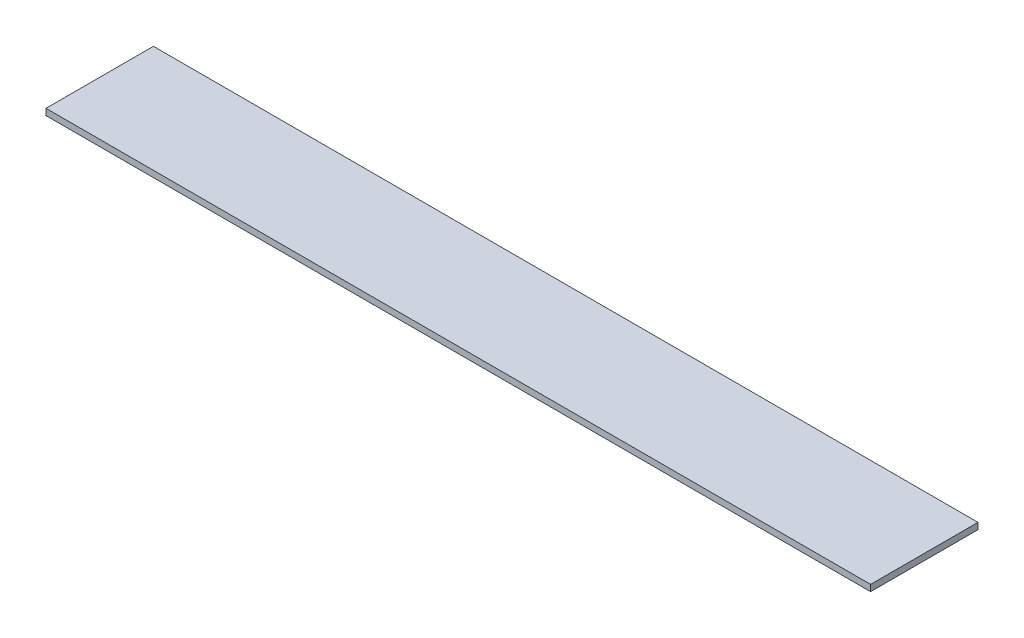
ISO-10303-21;
HEADER;
FILE_DESCRIPTION(('STEP AP214'),'2;1');
FILE_NAME('part.step','',(''),(''),'','','');
FILE_SCHEMA(('AUTOMOTIVE_DESIGN { 1 0 10303 214 1 1 1 1 }'));
ENDSEC;
DATA;
#1=APPLICATION_CONTEXT('core data for automotive mechanical design processes');
#2=APPLICATION_PROTOCOL_DEFINITION('international standard','automotive_design',2000,#1);
#3=PRODUCT_CONTEXT('',#1,'mechanical');
#4=PRODUCT('Part','Part','',(#3));
#5=PRODUCT_RELATED_PRODUCT_CATEGORY('part','',(#4));
#6=PRODUCT_DEFINITION_FORMATION('','',#4);
#7=PRODUCT_DEFINITION_CONTEXT('part definition',#1,'design');
#8=PRODUCT_DEFINITION('design','',#6,#7);
#9=PRODUCT_DEFINITION_SHAPE('','',#8);
#10=(LENGTH_UNIT() NAMED_UNIT(*) SI_UNIT(.MILLI.,.METRE.));
#11=(NAMED_UNIT(*) PLANE_ANGLE_UNIT() SI_UNIT($,.RADIAN.));
#12=(NAMED_UNIT(*) SI_UNIT($,.STERADIAN.) SOLID_ANGLE_UNIT());
#13=UNCERTAINTY_MEASURE_WITH_UNIT(LENGTH_MEASURE(1.E-05),#10,'distance_accuracy_value','');
#14=(GEOMETRIC_REPRESENTATION_CONTEXT(3) GLOBAL_UNCERTAINTY_ASSIGNED_CONTEXT((#13)) GLOBAL_UNIT_ASSIGNED_CONTEXT((#10,
#11,#12)) REPRESENTATION_CONTEXT('',''));
#15=CARTESIAN_POINT('',(0.,0.,0.));
#16=DIRECTION('',(0.,0.,1.));
#17=DIRECTION('',(1.,0.,0.));
#18=AXIS2_PLACEMENT_3D('',#15,#16,#17);
#19=CARTESIAN_POINT('',(-195.,1.49999999999999,50.8));
#20=DIRECTION('',(1.,0.,0.));
#21=DIRECTION('',(0.,0.,-1.));
#22=AXIS2_PLACEMENT_3D('',#19,#20,#21);
#23=PLANE('',#22);
#24=DIRECTION('',(0.,-1.,0.));
#25=VECTOR('',#24,1.);
#26=CARTESIAN_POINT('',(-195.,1.49999999999999,0.));
#27=LINE('',#26,#25);
#28=CARTESIAN_POINT('',(-195.,1.49999999999999,0.));
#29=VERTEX_POINT('',#28);
#30=CARTESIAN_POINT('',(-195.,-1.50000000000001,0.));
#31=VERTEX_POINT('',#30);
#32=EDGE_CURVE('E94',#29,#31,#27,.T.);
#33=ORIENTED_EDGE('',*,*,#32,.T.);
#34=DIRECTION('',(0.,0.,-1.));
#35=VECTOR('',#34,1.);
#36=CARTESIAN_POINT('',(-195.,-1.50000000000001,50.8));
#37=LINE('',#36,#35);
#38=CARTESIAN_POINT('',(-195.,-1.50000000000001,50.8));
#39=VERTEX_POINT('',#38);
#40=EDGE_CURVE('E11',#39,#31,#37,.T.);
#41=ORIENTED_EDGE('',*,*,#40,.F.);
#42=DIRECTION('',(0.,-1.,0.));
#43=VECTOR('',#42,1.);
#44=CARTESIAN_POINT('',(-195.,1.49999999999999,50.8));
#45=LINE('',#44,#43);
#46=CARTESIAN_POINT('',(-195.,1.49999999999999,50.8));
#47=VERTEX_POINT('',#46);
#48=EDGE_CURVE('E82',#47,#39,#45,.T.);
#49=ORIENTED_EDGE('',*,*,#48,.F.);
#50=DIRECTION('',(0.,0.,-1.));
#51=VECTOR('',#50,1.);
#52=CARTESIAN_POINT('',(-195.,1.49999999999999,50.8));
#53=LINE('',#52,#51);
#54=EDGE_CURVE('E90',#47,#29,#53,.T.);
#55=ORIENTED_EDGE('',*,*,#54,.T.);
#56=EDGE_LOOP('',(#33,#41,#49,#55));
#57=FACE_BOUND('',#56,.T.);
#58=ADVANCED_FACE('F31',(#57),#23,.F.);
#59=CARTESIAN_POINT('',(-195.,-1.50000000000001,50.8));
#60=DIRECTION('',(0.,1.,0.));
#61=DIRECTION('',(0.,0.,1.));
#62=AXIS2_PLACEMENT_3D('',#59,#60,#61);
#63=PLANE('',#62);
#64=DIRECTION('',(1.,0.,0.));
#65=VECTOR('',#64,1.);
#66=CARTESIAN_POINT('',(-195.,-1.50000000000001,0.));
#67=LINE('',#66,#65);
#68=CARTESIAN_POINT('',(195.,-1.50000000000001,0.));
#69=VERTEX_POINT('',#68);
#70=EDGE_CURVE('E86',#31,#69,#67,.T.);
#71=ORIENTED_EDGE('',*,*,#70,.T.);
#72=DIRECTION('',(0.,0.,-1.));
#73=VECTOR('',#72,1.);
#74=CARTESIAN_POINT('',(195.,-1.50000000000001,50.8));
#75=LINE('',#74,#73);
#76=CARTESIAN_POINT('',(195.,-1.50000000000001,50.8));
#77=VERTEX_POINT('',#76);
#78=EDGE_CURVE('E39',#77,#69,#75,.T.);
#79=ORIENTED_EDGE('',*,*,#78,.F.);
#80=DIRECTION('',(1.,0.,0.));
#81=VECTOR('',#80,1.);
#82=CARTESIAN_POINT('',(-195.,-1.50000000000001,50.8));
#83=LINE('',#82,#81);
#84=EDGE_CURVE('E77',#39,#77,#83,.T.);
#85=ORIENTED_EDGE('',*,*,#84,.F.);
#86=ORIENTED_EDGE('',*,*,#40,.T.);
#87=EDGE_LOOP('',(#71,#79,#85,#86));
#88=FACE_BOUND('',#87,.T.);
#89=ADVANCED_FACE('F85',(#88),#63,.F.);
#90=CARTESIAN_POINT('',(195.,1.49999999999999,50.8));
#91=DIRECTION('',(-1.,0.,0.));
#92=DIRECTION('',(0.,0.,1.));
#93=AXIS2_PLACEMENT_3D('',#90,#91,#92);
#94=PLANE('',#93);
#95=DIRECTION('',(0.,1.,0.));
#96=VECTOR('',#95,1.);
#97=CARTESIAN_POINT('',(195.,1.49999999999999,0.));
#98=LINE('',#97,#96);
#99=CARTESIAN_POINT('',(195.,1.49999999999999,0.));
#100=VERTEX_POINT('',#99);
#101=EDGE_CURVE('E64',#69,#100,#98,.T.);
#102=ORIENTED_EDGE('',*,*,#101,.T.);
#103=DIRECTION('',(0.,0.,-1.));
#104=VECTOR('',#103,1.);
#105=CARTESIAN_POINT('',(195.,1.49999999999999,50.8));
#106=LINE('',#105,#104);
#107=CARTESIAN_POINT('',(195.,1.49999999999999,50.8));
#108=VERTEX_POINT('',#107);
#109=EDGE_CURVE('E87',#108,#100,#106,.T.);
#110=ORIENTED_EDGE('',*,*,#109,.F.);
#111=DIRECTION('',(0.,1.,0.));
#112=VECTOR('',#111,1.);
#113=CARTESIAN_POINT('',(195.,1.49999999999999,50.8));
#114=LINE('',#113,#112);
#115=EDGE_CURVE('E80',#77,#108,#114,.T.);
#116=ORIENTED_EDGE('',*,*,#115,.F.);
#117=ORIENTED_EDGE('',*,*,#78,.T.);
#118=EDGE_LOOP('',(#102,#110,#116,#117));
#119=FACE_BOUND('',#118,.T.);
#120=ADVANCED_FACE('F88',(#119),#94,.F.);
#121=CARTESIAN_POINT('',(-195.,1.49999999999999,50.8));
#122=DIRECTION('',(0.,-1.,0.));
#123=DIRECTION('',(0.,0.,-1.));
#124=AXIS2_PLACEMENT_3D('',#121,#122,#123);
#125=PLANE('',#124);
#126=DIRECTION('',(-1.,0.,0.));
#127=VECTOR('',#126,1.);
#128=CARTESIAN_POINT('',(-195.,1.49999999999999,0.));
#129=LINE('',#128,#127);
#130=EDGE_CURVE('E70',#100,#29,#129,.T.);
#131=ORIENTED_EDGE('',*,*,#130,.T.);
#132=ORIENTED_EDGE('',*,*,#54,.F.);
#133=DIRECTION('',(-1.,0.,0.));
#134=VECTOR('',#133,1.);
#135=CARTESIAN_POINT('',(-195.,1.49999999999999,50.8));
#136=LINE('',#135,#134);
#137=EDGE_CURVE('E47',#108,#47,#136,.T.);
#138=ORIENTED_EDGE('',*,*,#137,.F.);
#139=ORIENTED_EDGE('',*,*,#109,.T.);
#140=EDGE_LOOP('',(#131,#132,#138,#139));
#141=FACE_BOUND('',#140,.T.);
#142=ADVANCED_FACE('F101',(#141),#125,.F.);
#143=CARTESIAN_POINT('',(-195.,-1.50000000000001,50.8));
#144=DIRECTION('',(0.,0.,1.));
#145=DIRECTION('',(1.,0.,0.));
#146=AXIS2_PLACEMENT_3D('',#143,#144,#145);
#147=PLANE('',#146);
#148=ORIENTED_EDGE('',*,*,#48,.T.);
#149=ORIENTED_EDGE('',*,*,#84,.T.);
#150=ORIENTED_EDGE('',*,*,#115,.T.);
#151=ORIENTED_EDGE('',*,*,#137,.T.);
#152=EDGE_LOOP('',(#148,#149,#150,#151));
#153=FACE_BOUND('',#152,.T.);
#154=ADVANCED_FACE('F78',(#153),#147,.T.);
#155=CARTESIAN_POINT('',(-195.,-1.50000000000001,0.));
#156=DIRECTION('',(0.,0.,1.));
#157=DIRECTION('',(1.,0.,0.));
#158=AXIS2_PLACEMENT_3D('',#155,#156,#157);
#159=PLANE('',#158);
#160=ORIENTED_EDGE('',*,*,#32,.F.);
#161=ORIENTED_EDGE('',*,*,#130,.F.);
#162=ORIENTED_EDGE('',*,*,#101,.F.);
#163=ORIENTED_EDGE('',*,*,#70,.F.);
#164=EDGE_LOOP('',(#160,#161,#162,#163));
#165=FACE_BOUND('',#164,.T.);
#166=ADVANCED_FACE('F104',(#165),#159,.F.);
#167=CLOSED_SHELL('',(#58,#89,#120,#142,#154,#166));
#168=MANIFOLD_SOLID_BREP('B2',#167);
#169=ADVANCED_BREP_SHAPE_REPRESENTATION('',(#18,#168),#14);
#170=SHAPE_DEFINITION_REPRESENTATION(#9,#169);
ENDSEC;
END-ISO-10303-21;
